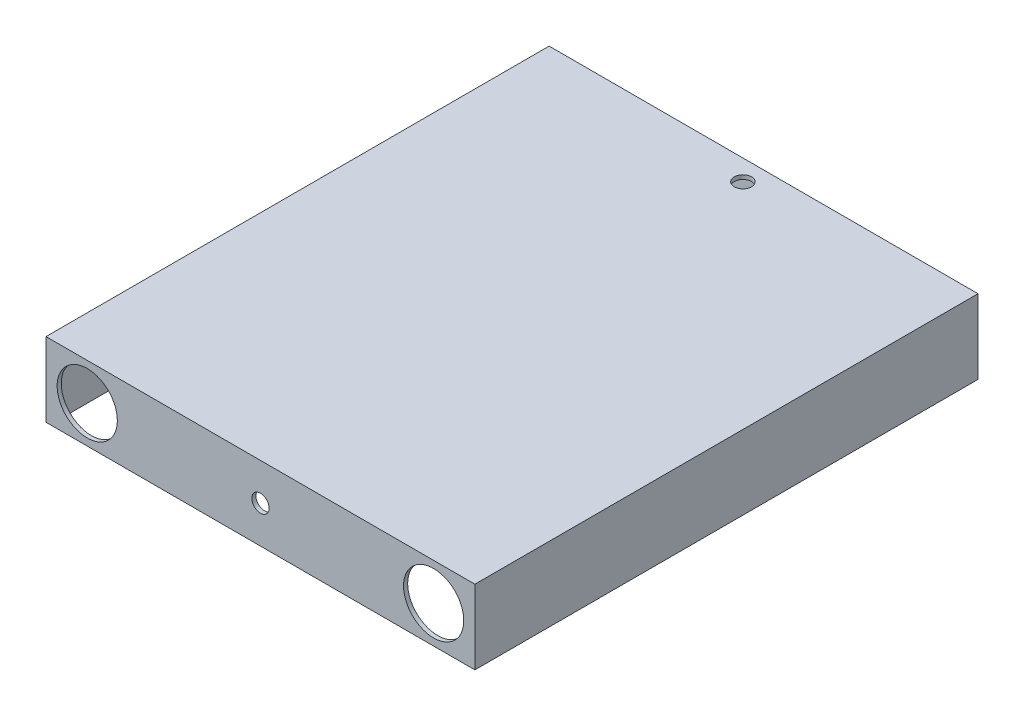
ISO-10303-21;
HEADER;
FILE_DESCRIPTION(('STEP AP214'),'2;1');
FILE_NAME('part.step','',(''),(''),'','','');
FILE_SCHEMA(('AUTOMOTIVE_DESIGN { 1 0 10303 214 1 1 1 1 }'));
ENDSEC;
DATA;
#1=APPLICATION_CONTEXT('core data for automotive mechanical design processes');
#2=APPLICATION_PROTOCOL_DEFINITION('international standard','automotive_design',2000,#1);
#3=PRODUCT_CONTEXT('',#1,'mechanical');
#4=PRODUCT('Part','Part','',(#3));
#5=PRODUCT_RELATED_PRODUCT_CATEGORY('part','',(#4));
#6=PRODUCT_DEFINITION_FORMATION('','',#4);
#7=PRODUCT_DEFINITION_CONTEXT('part definition',#1,'design');
#8=PRODUCT_DEFINITION('design','',#6,#7);
#9=PRODUCT_DEFINITION_SHAPE('','',#8);
#10=(LENGTH_UNIT() NAMED_UNIT(*) SI_UNIT(.MILLI.,.METRE.));
#11=(NAMED_UNIT(*) PLANE_ANGLE_UNIT() SI_UNIT($,.RADIAN.));
#12=(NAMED_UNIT(*) SI_UNIT($,.STERADIAN.) SOLID_ANGLE_UNIT());
#13=UNCERTAINTY_MEASURE_WITH_UNIT(LENGTH_MEASURE(1.E-05),#10,'distance_accuracy_value','');
#14=(GEOMETRIC_REPRESENTATION_CONTEXT(3) GLOBAL_UNCERTAINTY_ASSIGNED_CONTEXT((#13)) GLOBAL_UNIT_ASSIGNED_CONTEXT((#10,
#11,#12)) REPRESENTATION_CONTEXT('',''));
#15=CARTESIAN_POINT('',(0.,0.,0.));
#16=DIRECTION('',(0.,0.,1.));
#17=DIRECTION('',(1.,0.,0.));
#18=AXIS2_PLACEMENT_3D('',#15,#16,#17);
#19=CARTESIAN_POINT('',(-260.,45.,305.));
#20=DIRECTION('',(1.,0.,0.));
#21=DIRECTION('',(0.,0.,-1.));
#22=AXIS2_PLACEMENT_3D('',#19,#20,#21);
#23=PLANE('',#22);
#24=DIRECTION('',(0.,0.,1.));
#25=VECTOR('',#24,1.);
#26=CARTESIAN_POINT('',(-260.,-45.,305.));
#27=LINE('',#26,#25);
#28=CARTESIAN_POINT('',(-260.,-45.,-305.));
#29=VERTEX_POINT('',#28);
#30=CARTESIAN_POINT('',(-260.,-45.,305.));
#31=VERTEX_POINT('',#30);
#32=EDGE_CURVE('E131',#29,#31,#27,.T.);
#33=ORIENTED_EDGE('',*,*,#32,.T.);
#34=DIRECTION('',(0.,-1.,0.));
#35=VECTOR('',#34,1.);
#36=CARTESIAN_POINT('',(-260.,45.,305.));
#37=LINE('',#36,#35);
#38=CARTESIAN_POINT('',(-260.,45.,305.));
#39=VERTEX_POINT('',#38);
#40=EDGE_CURVE('E11',#39,#31,#37,.T.);
#41=ORIENTED_EDGE('',*,*,#40,.F.);
#42=DIRECTION('',(0.,0.,1.));
#43=VECTOR('',#42,1.);
#44=CARTESIAN_POINT('',(-260.,45.,305.));
#45=LINE('',#44,#43);
#46=CARTESIAN_POINT('',(-260.,45.,-305.));
#47=VERTEX_POINT('',#46);
#48=EDGE_CURVE('E155',#47,#39,#45,.T.);
#49=ORIENTED_EDGE('',*,*,#48,.F.);
#50=DIRECTION('',(0.,-1.,0.));
#51=VECTOR('',#50,1.);
#52=CARTESIAN_POINT('',(-260.,45.,-305.));
#53=LINE('',#52,#51);
#54=EDGE_CURVE('E160',#47,#29,#53,.T.);
#55=ORIENTED_EDGE('',*,*,#54,.T.);
#56=EDGE_LOOP('',(#33,#41,#49,#55));
#57=FACE_BOUND('',#56,.T.);
#58=ADVANCED_FACE('F33',(#57),#23,.F.);
#59=CARTESIAN_POINT('',(260.,45.,305.));
#60=DIRECTION('',(0.,0.,-1.));
#61=DIRECTION('',(-1.,0.,0.));
#62=AXIS2_PLACEMENT_3D('',#59,#60,#61);
#63=PLANE('',#62);
#64=CARTESIAN_POINT('',(210.,0.,305.));
#65=DIRECTION('',(0.,0.,1.));
#66=DIRECTION('',(-1.,0.,0.));
#67=AXIS2_PLACEMENT_3D('',#64,#65,#66);
#68=CIRCLE('',#67,36.5);
#69=CARTESIAN_POINT('',(173.5,0.,305.));
#70=VERTEX_POINT('',#69);
#71=EDGE_CURVE('E187',#70,#70,#68,.T.);
#72=ORIENTED_EDGE('',*,*,#71,.F.);
#73=EDGE_LOOP('',(#72));
#74=FACE_BOUND('',#73,.T.);
#75=CARTESIAN_POINT('',(-210.,0.,305.));
#76=DIRECTION('',(0.,0.,1.));
#77=DIRECTION('',(1.,0.,0.));
#78=AXIS2_PLACEMENT_3D('',#75,#76,#77);
#79=CIRCLE('',#78,36.5);
#80=CARTESIAN_POINT('',(-173.5,0.,305.));
#81=VERTEX_POINT('',#80);
#82=EDGE_CURVE('E178',#81,#81,#79,.T.);
#83=ORIENTED_EDGE('',*,*,#82,.F.);
#84=EDGE_LOOP('',(#83));
#85=FACE_BOUND('',#84,.T.);
#86=CARTESIAN_POINT('',(0.,0.,305.));
#87=DIRECTION('',(0.,0.,1.));
#88=DIRECTION('',(1.,0.,0.));
#89=AXIS2_PLACEMENT_3D('',#86,#87,#88);
#90=CIRCLE('',#89,10.5);
#91=CARTESIAN_POINT('',(10.5,0.,305.));
#92=VERTEX_POINT('',#91);
#93=EDGE_CURVE('E175',#92,#92,#90,.T.);
#94=ORIENTED_EDGE('',*,*,#93,.F.);
#95=EDGE_LOOP('',(#94));
#96=FACE_BOUND('',#95,.T.);
#97=DIRECTION('',(1.,0.,0.));
#98=VECTOR('',#97,1.);
#99=CARTESIAN_POINT('',(260.,-45.,305.));
#100=LINE('',#99,#98);
#101=CARTESIAN_POINT('',(260.,-45.,305.));
#102=VERTEX_POINT('',#101);
#103=EDGE_CURVE('E135',#31,#102,#100,.T.);
#104=ORIENTED_EDGE('',*,*,#103,.T.);
#105=DIRECTION('',(0.,-1.,0.));
#106=VECTOR('',#105,1.);
#107=CARTESIAN_POINT('',(260.,45.,305.));
#108=LINE('',#107,#106);
#109=CARTESIAN_POINT('',(260.,45.,305.));
#110=VERTEX_POINT('',#109);
#111=EDGE_CURVE('E41',#110,#102,#108,.T.);
#112=ORIENTED_EDGE('',*,*,#111,.F.);
#113=DIRECTION('',(1.,0.,0.));
#114=VECTOR('',#113,1.);
#115=CARTESIAN_POINT('',(260.,45.,305.));
#116=LINE('',#115,#114);
#117=EDGE_CURVE('E86',#39,#110,#116,.T.);
#118=ORIENTED_EDGE('',*,*,#117,.F.);
#119=ORIENTED_EDGE('',*,*,#40,.T.);
#120=EDGE_LOOP('',(#104,#112,#118,#119));
#121=FACE_BOUND('',#120,.T.);
#122=ADVANCED_FACE('F194',(#74,#85,#96,#121),#63,.F.);
#123=CARTESIAN_POINT('',(260.,45.,305.));
#124=DIRECTION('',(-1.,0.,0.));
#125=DIRECTION('',(0.,0.,1.));
#126=AXIS2_PLACEMENT_3D('',#123,#124,#125);
#127=PLANE('',#126);
#128=DIRECTION('',(0.,0.,-1.));
#129=VECTOR('',#128,1.);
#130=CARTESIAN_POINT('',(260.,-45.,305.));
#131=LINE('',#130,#129);
#132=CARTESIAN_POINT('',(260.,-45.,-305.));
#133=VERTEX_POINT('',#132);
#134=EDGE_CURVE('E163',#102,#133,#131,.T.);
#135=ORIENTED_EDGE('',*,*,#134,.T.);
#136=DIRECTION('',(0.,-1.,0.));
#137=VECTOR('',#136,1.);
#138=CARTESIAN_POINT('',(260.,45.,-305.));
#139=LINE('',#138,#137);
#140=CARTESIAN_POINT('',(260.,45.,-305.));
#141=VERTEX_POINT('',#140);
#142=EDGE_CURVE('E167',#141,#133,#139,.T.);
#143=ORIENTED_EDGE('',*,*,#142,.F.);
#144=DIRECTION('',(0.,0.,-1.));
#145=VECTOR('',#144,1.);
#146=CARTESIAN_POINT('',(260.,45.,305.));
#147=LINE('',#146,#145);
#148=EDGE_CURVE('E158',#110,#141,#147,.T.);
#149=ORIENTED_EDGE('',*,*,#148,.F.);
#150=ORIENTED_EDGE('',*,*,#111,.T.);
#151=EDGE_LOOP('',(#135,#143,#149,#150));
#152=FACE_BOUND('',#151,.T.);
#153=ADVANCED_FACE('F197',(#152),#127,.F.);
#154=CARTESIAN_POINT('',(260.,45.,-305.));
#155=DIRECTION('',(0.,0.,1.));
#156=DIRECTION('',(1.,0.,0.));
#157=AXIS2_PLACEMENT_3D('',#154,#155,#156);
#158=PLANE('',#157);
#159=DIRECTION('',(-1.,0.,0.));
#160=VECTOR('',#159,1.);
#161=CARTESIAN_POINT('',(260.,-45.,-305.));
#162=LINE('',#161,#160);
#163=EDGE_CURVE('E79',#133,#29,#162,.T.);
#164=ORIENTED_EDGE('',*,*,#163,.T.);
#165=ORIENTED_EDGE('',*,*,#54,.F.);
#166=DIRECTION('',(-1.,0.,0.));
#167=VECTOR('',#166,1.);
#168=CARTESIAN_POINT('',(260.,45.,-305.));
#169=LINE('',#168,#167);
#170=EDGE_CURVE('E58',#141,#47,#169,.T.);
#171=ORIENTED_EDGE('',*,*,#170,.F.);
#172=ORIENTED_EDGE('',*,*,#142,.T.);
#173=EDGE_LOOP('',(#164,#165,#171,#172));
#174=FACE_BOUND('',#173,.T.);
#175=ADVANCED_FACE('F210',(#174),#158,.F.);
#176=CARTESIAN_POINT('',(0.,45.,0.));
#177=DIRECTION('',(0.,1.,0.));
#178=DIRECTION('',(0.,0.,1.));
#179=AXIS2_PLACEMENT_3D('',#176,#177,#178);
#180=PLANE('',#179);
#181=CARTESIAN_POINT('',(0.,45.,-280.));
#182=DIRECTION('',(0.,1.,0.));
#183=DIRECTION('',(0.,0.,1.));
#184=AXIS2_PLACEMENT_3D('',#181,#182,#183);
#185=CIRCLE('',#184,10.5);
#186=CARTESIAN_POINT('',(0.,45.,-269.5));
#187=VERTEX_POINT('',#186);
#188=EDGE_CURVE('E140',#187,#187,#185,.T.);
#189=ORIENTED_EDGE('',*,*,#188,.F.);
#190=EDGE_LOOP('',(#189));
#191=FACE_BOUND('',#190,.T.);
#192=ORIENTED_EDGE('',*,*,#48,.T.);
#193=ORIENTED_EDGE('',*,*,#117,.T.);
#194=ORIENTED_EDGE('',*,*,#148,.T.);
#195=ORIENTED_EDGE('',*,*,#170,.T.);
#196=EDGE_LOOP('',(#192,#193,#194,#195));
#197=FACE_BOUND('',#196,.T.);
#198=ADVANCED_FACE('F212',(#191,#197),#180,.T.);
#199=CARTESIAN_POINT('',(0.,-45.,0.));
#200=DIRECTION('',(0.,1.,0.));
#201=DIRECTION('',(0.,0.,1.));
#202=AXIS2_PLACEMENT_3D('',#199,#200,#201);
#203=PLANE('',#202);
#204=DIRECTION('',(-1.,0.,0.));
#205=VECTOR('',#204,1.);
#206=CARTESIAN_POINT('',(260.,-45.,-300.));
#207=LINE('',#206,#205);
#208=CARTESIAN_POINT('',(255.,-45.,-300.));
#209=VERTEX_POINT('',#208);
#210=CARTESIAN_POINT('',(-255.,-45.,-300.));
#211=VERTEX_POINT('',#210);
#212=EDGE_CURVE('E126',#209,#211,#207,.T.);
#213=ORIENTED_EDGE('',*,*,#212,.T.);
#214=DIRECTION('',(0.,0.,1.));
#215=VECTOR('',#214,1.);
#216=CARTESIAN_POINT('',(-255.,-45.,305.));
#217=LINE('',#216,#215);
#218=CARTESIAN_POINT('',(-255.,-45.,300.));
#219=VERTEX_POINT('',#218);
#220=EDGE_CURVE('E148',#211,#219,#217,.T.);
#221=ORIENTED_EDGE('',*,*,#220,.T.);
#222=DIRECTION('',(1.,0.,0.));
#223=VECTOR('',#222,1.);
#224=CARTESIAN_POINT('',(260.,-45.,300.));
#225=LINE('',#224,#223);
#226=CARTESIAN_POINT('',(255.,-45.,300.));
#227=VERTEX_POINT('',#226);
#228=EDGE_CURVE('E130',#219,#227,#225,.T.);
#229=ORIENTED_EDGE('',*,*,#228,.T.);
#230=DIRECTION('',(0.,0.,-1.));
#231=VECTOR('',#230,1.);
#232=CARTESIAN_POINT('',(255.,-45.,305.));
#233=LINE('',#232,#231);
#234=EDGE_CURVE('E49',#227,#209,#233,.T.);
#235=ORIENTED_EDGE('',*,*,#234,.T.);
#236=EDGE_LOOP('',(#213,#221,#229,#235));
#237=FACE_BOUND('',#236,.T.);
#238=ORIENTED_EDGE('',*,*,#32,.F.);
#239=ORIENTED_EDGE('',*,*,#163,.F.);
#240=ORIENTED_EDGE('',*,*,#134,.F.);
#241=ORIENTED_EDGE('',*,*,#103,.F.);
#242=EDGE_LOOP('',(#238,#239,#240,#241));
#243=FACE_BOUND('',#242,.T.);
#244=ADVANCED_FACE('F207',(#237,#243),#203,.F.);
#245=CARTESIAN_POINT('',(-255.,45.,305.));
#246=DIRECTION('',(1.,0.,0.));
#247=DIRECTION('',(0.,0.,-1.));
#248=AXIS2_PLACEMENT_3D('',#245,#246,#247);
#249=PLANE('',#248);
#250=ORIENTED_EDGE('',*,*,#220,.F.);
#251=DIRECTION('',(0.,-1.,0.));
#252=VECTOR('',#251,1.);
#253=CARTESIAN_POINT('',(-255.,45.,-300.));
#254=LINE('',#253,#252);
#255=CARTESIAN_POINT('',(-255.,40.,-300.));
#256=VERTEX_POINT('',#255);
#257=EDGE_CURVE('E125',#256,#211,#254,.T.);
#258=ORIENTED_EDGE('',*,*,#257,.F.);
#259=DIRECTION('',(0.,0.,1.));
#260=VECTOR('',#259,1.);
#261=CARTESIAN_POINT('',(-255.,40.,305.));
#262=LINE('',#261,#260);
#263=CARTESIAN_POINT('',(-255.,40.,300.));
#264=VERTEX_POINT('',#263);
#265=EDGE_CURVE('E113',#256,#264,#262,.T.);
#266=ORIENTED_EDGE('',*,*,#265,.T.);
#267=DIRECTION('',(0.,-1.,0.));
#268=VECTOR('',#267,1.);
#269=CARTESIAN_POINT('',(-255.,45.,300.));
#270=LINE('',#269,#268);
#271=EDGE_CURVE('E123',#264,#219,#270,.T.);
#272=ORIENTED_EDGE('',*,*,#271,.T.);
#273=EDGE_LOOP('',(#250,#258,#266,#272));
#274=FACE_BOUND('',#273,.T.);
#275=ADVANCED_FACE('F122',(#274),#249,.T.);
#276=CARTESIAN_POINT('',(260.,45.,300.));
#277=DIRECTION('',(0.,0.,-1.));
#278=DIRECTION('',(-1.,0.,0.));
#279=AXIS2_PLACEMENT_3D('',#276,#277,#278);
#280=PLANE('',#279);
#281=CARTESIAN_POINT('',(210.,0.,300.));
#282=DIRECTION('',(0.,0.,-1.));
#283=DIRECTION('',(-1.,0.,0.));
#284=AXIS2_PLACEMENT_3D('',#281,#282,#283);
#285=CIRCLE('',#284,36.5);
#286=CARTESIAN_POINT('',(173.5,0.,300.));
#287=VERTEX_POINT('',#286);
#288=EDGE_CURVE('E36',#287,#287,#285,.T.);
#289=ORIENTED_EDGE('',*,*,#288,.F.);
#290=EDGE_LOOP('',(#289));
#291=FACE_BOUND('',#290,.T.);
#292=CARTESIAN_POINT('',(-210.,0.,300.));
#293=DIRECTION('',(0.,0.,-1.));
#294=DIRECTION('',(-1.,0.,0.));
#295=AXIS2_PLACEMENT_3D('',#292,#293,#294);
#296=CIRCLE('',#295,36.5);
#297=CARTESIAN_POINT('',(-246.5,0.,300.));
#298=VERTEX_POINT('',#297);
#299=EDGE_CURVE('E176',#298,#298,#296,.T.);
#300=ORIENTED_EDGE('',*,*,#299,.F.);
#301=EDGE_LOOP('',(#300));
#302=FACE_BOUND('',#301,.T.);
#303=CARTESIAN_POINT('',(0.,0.,300.));
#304=DIRECTION('',(0.,0.,-1.));
#305=DIRECTION('',(-1.,0.,0.));
#306=AXIS2_PLACEMENT_3D('',#303,#304,#305);
#307=CIRCLE('',#306,10.5);
#308=CARTESIAN_POINT('',(-10.5,0.,300.));
#309=VERTEX_POINT('',#308);
#310=EDGE_CURVE('E173',#309,#309,#307,.T.);
#311=ORIENTED_EDGE('',*,*,#310,.F.);
#312=EDGE_LOOP('',(#311));
#313=FACE_BOUND('',#312,.T.);
#314=ORIENTED_EDGE('',*,*,#228,.F.);
#315=ORIENTED_EDGE('',*,*,#271,.F.);
#316=DIRECTION('',(1.,0.,0.));
#317=VECTOR('',#316,1.);
#318=CARTESIAN_POINT('',(260.,40.,300.));
#319=LINE('',#318,#317);
#320=CARTESIAN_POINT('',(255.,40.,300.));
#321=VERTEX_POINT('',#320);
#322=EDGE_CURVE('E109',#264,#321,#319,.T.);
#323=ORIENTED_EDGE('',*,*,#322,.T.);
#324=DIRECTION('',(0.,-1.,0.));
#325=VECTOR('',#324,1.);
#326=CARTESIAN_POINT('',(255.,45.,300.));
#327=LINE('',#326,#325);
#328=EDGE_CURVE('E132',#321,#227,#327,.T.);
#329=ORIENTED_EDGE('',*,*,#328,.T.);
#330=EDGE_LOOP('',(#314,#315,#323,#329));
#331=FACE_BOUND('',#330,.T.);
#332=ADVANCED_FACE('F128',(#291,#302,#313,#331),#280,.T.);
#333=CARTESIAN_POINT('',(255.,45.,305.));
#334=DIRECTION('',(-1.,0.,0.));
#335=DIRECTION('',(0.,0.,1.));
#336=AXIS2_PLACEMENT_3D('',#333,#334,#335);
#337=PLANE('',#336);
#338=ORIENTED_EDGE('',*,*,#234,.F.);
#339=ORIENTED_EDGE('',*,*,#328,.F.);
#340=DIRECTION('',(0.,0.,-1.));
#341=VECTOR('',#340,1.);
#342=CARTESIAN_POINT('',(255.,40.,305.));
#343=LINE('',#342,#341);
#344=CARTESIAN_POINT('',(255.,40.,-300.));
#345=VERTEX_POINT('',#344);
#346=EDGE_CURVE('E114',#321,#345,#343,.T.);
#347=ORIENTED_EDGE('',*,*,#346,.T.);
#348=DIRECTION('',(0.,-1.,0.));
#349=VECTOR('',#348,1.);
#350=CARTESIAN_POINT('',(255.,45.,-300.));
#351=LINE('',#350,#349);
#352=EDGE_CURVE('E137',#345,#209,#351,.T.);
#353=ORIENTED_EDGE('',*,*,#352,.T.);
#354=EDGE_LOOP('',(#338,#339,#347,#353));
#355=FACE_BOUND('',#354,.T.);
#356=ADVANCED_FACE('F263',(#355),#337,.T.);
#357=CARTESIAN_POINT('',(260.,45.,-300.));
#358=DIRECTION('',(0.,0.,1.));
#359=DIRECTION('',(1.,0.,0.));
#360=AXIS2_PLACEMENT_3D('',#357,#358,#359);
#361=PLANE('',#360);
#362=ORIENTED_EDGE('',*,*,#212,.F.);
#363=ORIENTED_EDGE('',*,*,#352,.F.);
#364=DIRECTION('',(-1.,0.,0.));
#365=VECTOR('',#364,1.);
#366=CARTESIAN_POINT('',(260.,40.,-300.));
#367=LINE('',#366,#365);
#368=EDGE_CURVE('E143',#345,#256,#367,.T.);
#369=ORIENTED_EDGE('',*,*,#368,.T.);
#370=ORIENTED_EDGE('',*,*,#257,.T.);
#371=EDGE_LOOP('',(#362,#363,#369,#370));
#372=FACE_BOUND('',#371,.T.);
#373=ADVANCED_FACE('F268',(#372),#361,.T.);
#374=CARTESIAN_POINT('',(0.,40.,0.));
#375=DIRECTION('',(0.,1.,0.));
#376=DIRECTION('',(0.,0.,1.));
#377=AXIS2_PLACEMENT_3D('',#374,#375,#376);
#378=PLANE('',#377);
#379=CARTESIAN_POINT('',(0.,40.,-280.));
#380=DIRECTION('',(0.,1.,0.));
#381=DIRECTION('',(0.,0.,1.));
#382=AXIS2_PLACEMENT_3D('',#379,#380,#381);
#383=CIRCLE('',#382,10.5);
#384=CARTESIAN_POINT('',(0.,40.,-269.5));
#385=VERTEX_POINT('',#384);
#386=EDGE_CURVE('E150',#385,#385,#383,.T.);
#387=ORIENTED_EDGE('',*,*,#386,.T.);
#388=EDGE_LOOP('',(#387));
#389=FACE_BOUND('',#388,.T.);
#390=ORIENTED_EDGE('',*,*,#265,.F.);
#391=ORIENTED_EDGE('',*,*,#368,.F.);
#392=ORIENTED_EDGE('',*,*,#346,.F.);
#393=ORIENTED_EDGE('',*,*,#322,.F.);
#394=EDGE_LOOP('',(#390,#391,#392,#393));
#395=FACE_BOUND('',#394,.T.);
#396=ADVANCED_FACE('F111',(#389,#395),#378,.F.);
#397=CARTESIAN_POINT('',(0.,35.,-280.));
#398=DIRECTION('',(0.,1.,0.));
#399=DIRECTION('',(0.,0.,1.));
#400=AXIS2_PLACEMENT_3D('',#397,#398,#399);
#401=CYLINDRICAL_SURFACE('',#400,10.5);
#402=ORIENTED_EDGE('',*,*,#188,.T.);
#403=EDGE_LOOP('',(#402));
#404=FACE_BOUND('',#403,.T.);
#405=ORIENTED_EDGE('',*,*,#386,.F.);
#406=EDGE_LOOP('',(#405));
#407=FACE_BOUND('',#406,.T.);
#408=ADVANCED_FACE('F291',(#404,#407),#401,.F.);
#409=CARTESIAN_POINT('',(0.,0.,295.));
#410=DIRECTION('',(0.,0.,1.));
#411=DIRECTION('',(1.,0.,0.));
#412=AXIS2_PLACEMENT_3D('',#409,#410,#411);
#413=CYLINDRICAL_SURFACE('',#412,10.5);
#414=ORIENTED_EDGE('',*,*,#310,.T.);
#415=EDGE_LOOP('',(#414));
#416=FACE_BOUND('',#415,.T.);
#417=ORIENTED_EDGE('',*,*,#93,.T.);
#418=EDGE_LOOP('',(#417));
#419=FACE_BOUND('',#418,.T.);
#420=ADVANCED_FACE('F300',(#416,#419),#413,.F.);
#421=CARTESIAN_POINT('',(-210.,0.,280.));
#422=DIRECTION('',(0.,0.,1.));
#423=DIRECTION('',(1.,0.,0.));
#424=AXIS2_PLACEMENT_3D('',#421,#422,#423);
#425=CYLINDRICAL_SURFACE('',#424,36.5);
#426=ORIENTED_EDGE('',*,*,#299,.T.);
#427=EDGE_LOOP('',(#426));
#428=FACE_BOUND('',#427,.T.);
#429=ORIENTED_EDGE('',*,*,#82,.T.);
#430=EDGE_LOOP('',(#429));
#431=FACE_BOUND('',#430,.T.);
#432=ADVANCED_FACE('F309',(#428,#431),#425,.F.);
#433=CARTESIAN_POINT('',(210.,0.,280.));
#434=DIRECTION('',(0.,0.,1.));
#435=DIRECTION('',(1.,0.,0.));
#436=AXIS2_PLACEMENT_3D('',#433,#434,#435);
#437=CYLINDRICAL_SURFACE('',#436,36.5);
#438=ORIENTED_EDGE('',*,*,#288,.T.);
#439=EDGE_LOOP('',(#438));
#440=FACE_BOUND('',#439,.T.);
#441=ORIENTED_EDGE('',*,*,#71,.T.);
#442=EDGE_LOOP('',(#441));
#443=FACE_BOUND('',#442,.T.);
#444=ADVANCED_FACE('F192',(#440,#443),#437,.F.);
#445=CLOSED_SHELL('',(#58,#122,#153,#175,#198,#244,#275,#332,#356,#373,#396,#408,#420,#432,#444));
#446=MANIFOLD_SOLID_BREP('B2',#445);
#447=ADVANCED_BREP_SHAPE_REPRESENTATION('',(#18,#446),#14);
#448=SHAPE_DEFINITION_REPRESENTATION(#9,#447);
ENDSEC;
END-ISO-10303-21;
